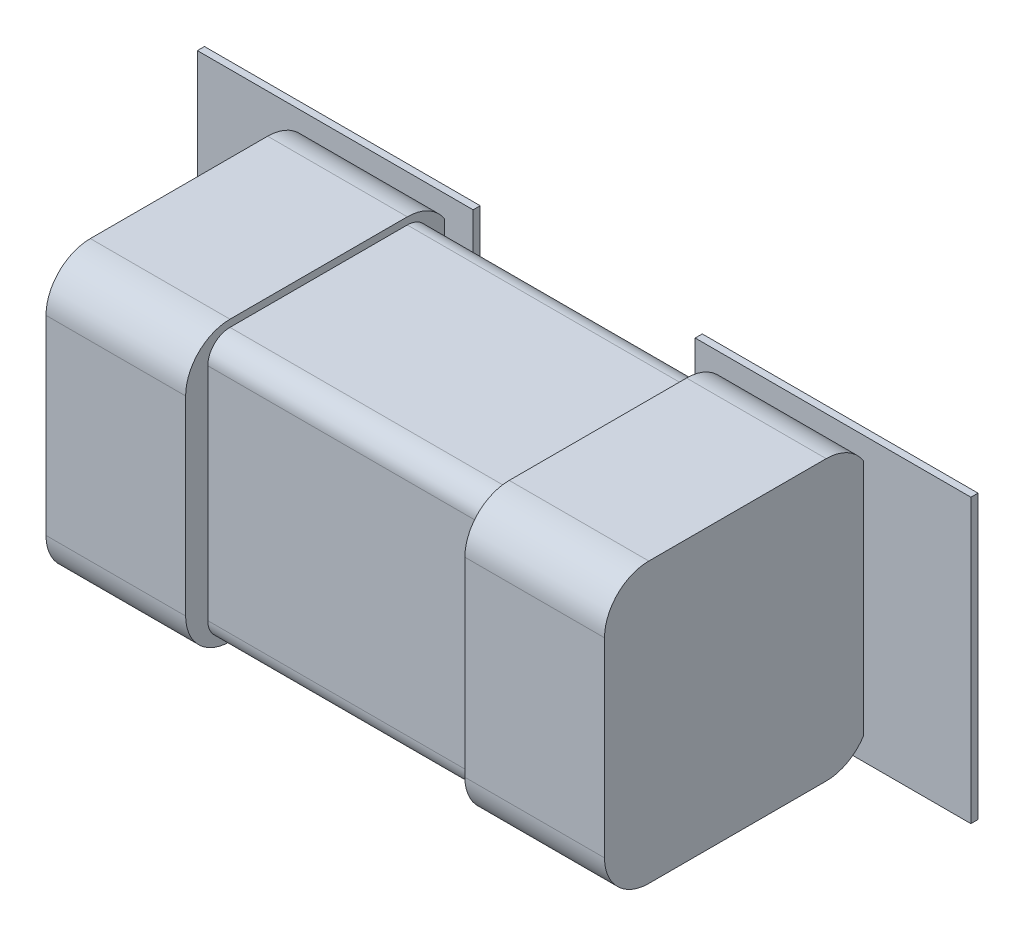
ISO-10303-21;
HEADER;
FILE_DESCRIPTION(('STEP AP214'),'2;1');
FILE_NAME('part.step','',(''),(''),'','','');
FILE_SCHEMA(('AUTOMOTIVE_DESIGN { 1 0 10303 214 1 1 1 1 }'));
ENDSEC;
DATA;
#1=APPLICATION_CONTEXT('core data for automotive mechanical design processes');
#2=APPLICATION_PROTOCOL_DEFINITION('international standard','automotive_design',2000,#1);
#3=PRODUCT_CONTEXT('',#1,'mechanical');
#4=PRODUCT('Part','Part','',(#3));
#5=PRODUCT_RELATED_PRODUCT_CATEGORY('part','',(#4));
#6=PRODUCT_DEFINITION_FORMATION('','',#4);
#7=PRODUCT_DEFINITION_CONTEXT('part definition',#1,'design');
#8=PRODUCT_DEFINITION('design','',#6,#7);
#9=PRODUCT_DEFINITION_SHAPE('','',#8);
#10=(LENGTH_UNIT() NAMED_UNIT(*) SI_UNIT(.MILLI.,.METRE.));
#11=(NAMED_UNIT(*) PLANE_ANGLE_UNIT() SI_UNIT($,.RADIAN.));
#12=(NAMED_UNIT(*) SI_UNIT($,.STERADIAN.) SOLID_ANGLE_UNIT());
#13=UNCERTAINTY_MEASURE_WITH_UNIT(LENGTH_MEASURE(1.E-05),#10,'distance_accuracy_value','');
#14=(GEOMETRIC_REPRESENTATION_CONTEXT(3) GLOBAL_UNCERTAINTY_ASSIGNED_CONTEXT((#13)) GLOBAL_UNIT_ASSIGNED_CONTEXT((#10,
#11,#12)) REPRESENTATION_CONTEXT('',''));
#15=CARTESIAN_POINT('',(0.,0.,0.));
#16=DIRECTION('',(0.,0.,1.));
#17=DIRECTION('',(1.,0.,0.));
#18=AXIS2_PLACEMENT_3D('',#15,#16,#17);
#19=CARTESIAN_POINT('',(0.,0.,0.0762));
#20=DIRECTION('',(0.,0.,1.));
#21=DIRECTION('',(1.,0.,0.));
#22=AXIS2_PLACEMENT_3D('',#19,#20,#21);
#23=PLANE('',#22);
#24=DIRECTION('',(0.,1.,0.));
#25=VECTOR('',#24,1.);
#26=CARTESIAN_POINT('',(-0.318008,-0.405003,0.0762));
#27=LINE('',#26,#25);
#28=CARTESIAN_POINT('',(-0.318008,-0.405003,0.0762));
#29=VERTEX_POINT('',#28);
#30=CARTESIAN_POINT('',(-0.318008,0.405003,0.0762));
#31=VERTEX_POINT('',#30);
#32=EDGE_CURVE('E281',#29,#31,#27,.T.);
#33=ORIENTED_EDGE('',*,*,#32,.F.);
#34=DIRECTION('',(1.,0.,0.));
#35=VECTOR('',#34,1.);
#36=CARTESIAN_POINT('',(-1.1079988,-0.405003,0.0762));
#37=LINE('',#36,#35);
#38=CARTESIAN_POINT('',(-1.1079988,-0.405003,0.0762));
#39=VERTEX_POINT('',#38);
#40=EDGE_CURVE('E286',#39,#29,#37,.T.);
#41=ORIENTED_EDGE('',*,*,#40,.F.);
#42=DIRECTION('',(0.,1.,0.));
#43=VECTOR('',#42,1.);
#44=CARTESIAN_POINT('',(-1.1079988,0.405003,0.0762));
#45=LINE('',#44,#43);
#46=CARTESIAN_POINT('',(-1.1079988,0.405003,0.0762));
#47=VERTEX_POINT('',#46);
#48=EDGE_CURVE('E258',#47,#39,#45,.F.);
#49=ORIENTED_EDGE('',*,*,#48,.F.);
#50=DIRECTION('',(1.,0.,0.));
#51=VECTOR('',#50,1.);
#52=CARTESIAN_POINT('',(-0.318008,0.405003,0.0762));
#53=LINE('',#52,#51);
#54=EDGE_CURVE('E276',#31,#47,#53,.F.);
#55=ORIENTED_EDGE('',*,*,#54,.F.);
#56=EDGE_LOOP('',(#33,#41,#49,#55));
#57=FACE_BOUND('',#56,.T.);
#58=ADVANCED_FACE('F15',(#57),#23,.F.);
#59=CARTESIAN_POINT('',(-1.1079988,-0.405003,0.0762));
#60=DIRECTION('',(0.,-1.,0.));
#61=DIRECTION('',(0.,0.,-1.));
#62=AXIS2_PLACEMENT_3D('',#59,#60,#61);
#63=PLANE('',#62);
#64=DIRECTION('',(0.,0.,1.));
#65=VECTOR('',#64,1.);
#66=CARTESIAN_POINT('',(-1.1079988,-0.405003,0.0762));
#67=LINE('',#66,#65);
#68=CARTESIAN_POINT('',(-1.1079988,-0.405003,0.09652));
#69=VERTEX_POINT('',#68);
#70=EDGE_CURVE('E274',#39,#69,#67,.T.);
#71=ORIENTED_EDGE('',*,*,#70,.F.);
#72=ORIENTED_EDGE('',*,*,#40,.T.);
#73=DIRECTION('',(0.,0.,-1.));
#74=VECTOR('',#73,1.);
#75=CARTESIAN_POINT('',(-0.318008,-0.405003,0.0762));
#76=LINE('',#75,#74);
#77=CARTESIAN_POINT('',(-0.318008,-0.405003,0.09652));
#78=VERTEX_POINT('',#77);
#79=EDGE_CURVE('E283',#78,#29,#76,.T.);
#80=ORIENTED_EDGE('',*,*,#79,.F.);
#81=DIRECTION('',(1.,0.,0.));
#82=VECTOR('',#81,1.);
#83=CARTESIAN_POINT('',(0.,-0.405003,0.09652));
#84=LINE('',#83,#82);
#85=EDGE_CURVE('E257',#69,#78,#84,.T.);
#86=ORIENTED_EDGE('',*,*,#85,.F.);
#87=EDGE_LOOP('',(#71,#72,#80,#86));
#88=FACE_BOUND('',#87,.T.);
#89=ADVANCED_FACE('F915',(#88),#63,.T.);
#90=CARTESIAN_POINT('',(-0.318008,-0.405003,0.0762));
#91=DIRECTION('',(1.,0.,0.));
#92=DIRECTION('',(0.,0.,-1.));
#93=AXIS2_PLACEMENT_3D('',#90,#91,#92);
#94=PLANE('',#93);
#95=ORIENTED_EDGE('',*,*,#79,.T.);
#96=ORIENTED_EDGE('',*,*,#32,.T.);
#97=DIRECTION('',(0.,0.,1.));
#98=VECTOR('',#97,1.);
#99=CARTESIAN_POINT('',(-0.318008,0.405003,0.0762));
#100=LINE('',#99,#98);
#101=CARTESIAN_POINT('',(-0.318008,0.405003,0.09652));
#102=VERTEX_POINT('',#101);
#103=EDGE_CURVE('E278',#102,#31,#100,.F.);
#104=ORIENTED_EDGE('',*,*,#103,.F.);
#105=DIRECTION('',(0.,1.,0.));
#106=VECTOR('',#105,1.);
#107=CARTESIAN_POINT('',(-0.318008,0.,0.09652));
#108=LINE('',#107,#106);
#109=EDGE_CURVE('E255',#78,#102,#108,.T.);
#110=ORIENTED_EDGE('',*,*,#109,.F.);
#111=EDGE_LOOP('',(#95,#96,#104,#110));
#112=FACE_BOUND('',#111,.T.);
#113=ADVANCED_FACE('F906',(#112),#94,.T.);
#114=CARTESIAN_POINT('',(-0.318008,0.405003,0.0762));
#115=DIRECTION('',(0.,1.,0.));
#116=DIRECTION('',(0.,0.,1.));
#117=AXIS2_PLACEMENT_3D('',#114,#115,#116);
#118=PLANE('',#117);
#119=ORIENTED_EDGE('',*,*,#103,.T.);
#120=ORIENTED_EDGE('',*,*,#54,.T.);
#121=DIRECTION('',(0.,0.,1.));
#122=VECTOR('',#121,1.);
#123=CARTESIAN_POINT('',(-1.1079988,0.405003,0.0762));
#124=LINE('',#123,#122);
#125=CARTESIAN_POINT('',(-1.1079988,0.405003,0.09652));
#126=VERTEX_POINT('',#125);
#127=EDGE_CURVE('E271',#126,#47,#124,.F.);
#128=ORIENTED_EDGE('',*,*,#127,.F.);
#129=DIRECTION('',(1.,0.,0.));
#130=VECTOR('',#129,1.);
#131=CARTESIAN_POINT('',(0.,0.405003,0.09652));
#132=LINE('',#131,#130);
#133=EDGE_CURVE('E253',#102,#126,#132,.F.);
#134=ORIENTED_EDGE('',*,*,#133,.F.);
#135=EDGE_LOOP('',(#119,#120,#128,#134));
#136=FACE_BOUND('',#135,.T.);
#137=ADVANCED_FACE('F897',(#136),#118,.T.);
#138=CARTESIAN_POINT('',(-1.1079988,0.405003,0.0762));
#139=DIRECTION('',(-1.,0.,0.));
#140=DIRECTION('',(0.,0.,1.));
#141=AXIS2_PLACEMENT_3D('',#138,#139,#140);
#142=PLANE('',#141);
#143=ORIENTED_EDGE('',*,*,#127,.T.);
#144=ORIENTED_EDGE('',*,*,#48,.T.);
#145=ORIENTED_EDGE('',*,*,#70,.T.);
#146=DIRECTION('',(0.,1.,0.));
#147=VECTOR('',#146,1.);
#148=CARTESIAN_POINT('',(-1.1079988,0.,0.09652));
#149=LINE('',#148,#147);
#150=EDGE_CURVE('E236',#126,#69,#149,.F.);
#151=ORIENTED_EDGE('',*,*,#150,.F.);
#152=EDGE_LOOP('',(#143,#144,#145,#151));
#153=FACE_BOUND('',#152,.T.);
#154=ADVANCED_FACE('F887',(#153),#142,.T.);
#155=CARTESIAN_POINT('',(-0.800000000000102,0.399999999999924,0.0762));
#156=DIRECTION('',(-1.,0.,0.));
#157=DIRECTION('',(0.,0.,1.));
#158=AXIS2_PLACEMENT_3D('',#155,#156,#157);
#159=PLANE('',#158);
#160=CARTESIAN_POINT('',(-0.800000000000102,0.272999999999924,0.2032));
#161=DIRECTION('',(1.,0.,0.));
#162=DIRECTION('',(0.,0.,-1.));
#163=AXIS2_PLACEMENT_3D('',#160,#161,#162);
#164=CIRCLE('',#163,0.127);
#165=CARTESIAN_POINT('',(-0.800000000000102,0.341908472628476,0.0965199999999994));
#166=VERTEX_POINT('',#165);
#167=CARTESIAN_POINT('',(-0.800000000000102,0.399999999999924,0.2032));
#168=VERTEX_POINT('',#167);
#169=EDGE_CURVE('E230',#166,#168,#164,.T.);
#170=ORIENTED_EDGE('',*,*,#169,.F.);
#171=DIRECTION('',(0.,1.,0.));
#172=VECTOR('',#171,1.);
#173=CARTESIAN_POINT('',(-0.800000000000102,0.,0.09652));
#174=LINE('',#173,#172);
#175=CARTESIAN_POINT('',(-0.800000000000102,-0.341908472628476,0.0965199999999994));
#176=VERTEX_POINT('',#175);
#177=EDGE_CURVE('E225',#176,#166,#174,.T.);
#178=ORIENTED_EDGE('',*,*,#177,.F.);
#179=CARTESIAN_POINT('',(-0.800000000000102,-0.272999999999924,0.2032));
#180=DIRECTION('',(1.,0.,0.));
#181=DIRECTION('',(0.,0.,-1.));
#182=AXIS2_PLACEMENT_3D('',#179,#180,#181);
#183=CIRCLE('',#182,0.127);
#184=CARTESIAN_POINT('',(-0.800000000000102,-0.399999999999924,0.2032));
#185=VERTEX_POINT('',#184);
#186=EDGE_CURVE('E18',#185,#176,#183,.T.);
#187=ORIENTED_EDGE('',*,*,#186,.F.);
#188=DIRECTION('',(0.,0.,-1.));
#189=VECTOR('',#188,1.);
#190=CARTESIAN_POINT('',(-0.800000000000102,-0.399999999999924,0.0762));
#191=LINE('',#190,#189);
#192=CARTESIAN_POINT('',(-0.800000000000102,-0.399999999999924,0.7112));
#193=VERTEX_POINT('',#192);
#194=EDGE_CURVE('E220',#193,#185,#191,.T.);
#195=ORIENTED_EDGE('',*,*,#194,.F.);
#196=CARTESIAN_POINT('',(-0.800000000000102,-0.272999999999924,0.7112));
#197=DIRECTION('',(1.,0.,0.));
#198=DIRECTION('',(0.,0.,-1.));
#199=AXIS2_PLACEMENT_3D('',#196,#197,#198);
#200=CIRCLE('',#199,0.127);
#201=CARTESIAN_POINT('',(-0.800000000000102,-0.272999999999924,0.8382));
#202=VERTEX_POINT('',#201);
#203=EDGE_CURVE('E367',#202,#193,#200,.T.);
#204=ORIENTED_EDGE('',*,*,#203,.F.);
#205=DIRECTION('',(0.,1.,0.));
#206=VECTOR('',#205,1.);
#207=CARTESIAN_POINT('',(-0.800000000000102,0.,0.8382));
#208=LINE('',#207,#206);
#209=CARTESIAN_POINT('',(-0.800000000000102,0.272999999999924,0.8382));
#210=VERTEX_POINT('',#209);
#211=EDGE_CURVE('E264',#210,#202,#208,.F.);
#212=ORIENTED_EDGE('',*,*,#211,.F.);
#213=CARTESIAN_POINT('',(-0.800000000000102,0.272999999999924,0.7112));
#214=DIRECTION('',(-1.,0.,0.));
#215=DIRECTION('',(0.,0.,1.));
#216=AXIS2_PLACEMENT_3D('',#213,#214,#215);
#217=CIRCLE('',#216,0.127);
#218=CARTESIAN_POINT('',(-0.800000000000102,0.399999999999924,0.7112));
#219=VERTEX_POINT('',#218);
#220=EDGE_CURVE('E263',#219,#210,#217,.F.);
#221=ORIENTED_EDGE('',*,*,#220,.F.);
#222=DIRECTION('',(0.,0.,1.));
#223=VECTOR('',#222,1.);
#224=CARTESIAN_POINT('',(-0.800000000000102,0.399999999999924,0.0762));
#225=LINE('',#224,#223);
#226=EDGE_CURVE('E260',#168,#219,#225,.T.);
#227=ORIENTED_EDGE('',*,*,#226,.F.);
#228=EDGE_LOOP('',(#170,#178,#187,#195,#204,#212,#221,#227));
#229=FACE_BOUND('',#228,.T.);
#230=ADVANCED_FACE('F227',(#229),#159,.T.);
#231=CARTESIAN_POINT('',(0.,0.,0.09652));
#232=DIRECTION('',(0.,0.,1.));
#233=DIRECTION('',(1.,0.,0.));
#234=AXIS2_PLACEMENT_3D('',#231,#232,#233);
#235=PLANE('',#234);
#236=DIRECTION('',(1.,0.,0.));
#237=VECTOR('',#236,1.);
#238=CARTESIAN_POINT('',(0.800000000000102,-0.341908472628475,0.0965199999999988));
#239=LINE('',#238,#237);
#240=CARTESIAN_POINT('',(-0.399999999999924,-0.341908472628476,0.0965199999999994));
#241=VERTEX_POINT('',#240);
#242=EDGE_CURVE('E235',#176,#241,#239,.T.);
#243=ORIENTED_EDGE('',*,*,#242,.F.);
#244=ORIENTED_EDGE('',*,*,#177,.T.);
#245=DIRECTION('',(1.,0.,0.));
#246=VECTOR('',#245,1.);
#247=CARTESIAN_POINT('',(0.800000000000102,0.341908472628475,0.0965199999999988));
#248=LINE('',#247,#246);
#249=CARTESIAN_POINT('',(-0.399999999999924,0.341908472628476,0.0965199999999994));
#250=VERTEX_POINT('',#249);
#251=EDGE_CURVE('E364',#250,#166,#248,.F.);
#252=ORIENTED_EDGE('',*,*,#251,.F.);
#253=DIRECTION('',(0.,1.,0.));
#254=VECTOR('',#253,1.);
#255=CARTESIAN_POINT('',(-0.399999999999924,0.399999999999924,0.09652));
#256=LINE('',#255,#254);
#257=EDGE_CURVE('E246',#250,#241,#256,.F.);
#258=ORIENTED_EDGE('',*,*,#257,.T.);
#259=EDGE_LOOP('',(#243,#244,#252,#258));
#260=FACE_BOUND('',#259,.T.);
#261=ORIENTED_EDGE('',*,*,#133,.T.);
#262=ORIENTED_EDGE('',*,*,#150,.T.);
#263=ORIENTED_EDGE('',*,*,#85,.T.);
#264=ORIENTED_EDGE('',*,*,#109,.T.);
#265=EDGE_LOOP('',(#261,#262,#263,#264));
#266=FACE_BOUND('',#265,.T.);
#267=ADVANCED_FACE('F244',(#260,#266),#235,.T.);
#268=CARTESIAN_POINT('',(0.800000000000102,-0.272999999999924,0.2032));
#269=DIRECTION('',(1.,0.,0.));
#270=DIRECTION('',(0.,0.,-1.));
#271=AXIS2_PLACEMENT_3D('',#268,#269,#270);
#272=CYLINDRICAL_SURFACE('',#271,0.127);
#273=DIRECTION('',(1.,0.,0.));
#274=VECTOR('',#273,1.);
#275=CARTESIAN_POINT('',(-0.800000000000102,-0.399999999999924,0.2032));
#276=LINE('',#275,#274);
#277=CARTESIAN_POINT('',(-0.399999999999924,-0.399999999999924,0.2032));
#278=VERTEX_POINT('',#277);
#279=EDGE_CURVE('E242',#185,#278,#276,.T.);
#280=ORIENTED_EDGE('',*,*,#279,.F.);
#281=ORIENTED_EDGE('',*,*,#186,.T.);
#282=ORIENTED_EDGE('',*,*,#242,.T.);
#283=CARTESIAN_POINT('',(-0.399999999999924,-0.272999999999924,0.2032));
#284=DIRECTION('',(1.,0.,0.));
#285=DIRECTION('',(0.,0.,-1.));
#286=AXIS2_PLACEMENT_3D('',#283,#284,#285);
#287=CIRCLE('',#286,0.127);
#288=EDGE_CURVE('E361',#241,#278,#287,.F.);
#289=ORIENTED_EDGE('',*,*,#288,.T.);
#290=EDGE_LOOP('',(#280,#281,#282,#289));
#291=FACE_BOUND('',#290,.T.);
#292=ADVANCED_FACE('F239',(#291),#272,.T.);
#293=CARTESIAN_POINT('',(-0.800000000000102,-0.399999999999924,0.0762));
#294=DIRECTION('',(0.,-1.,0.));
#295=DIRECTION('',(0.,0.,-1.));
#296=AXIS2_PLACEMENT_3D('',#293,#294,#295);
#297=PLANE('',#296);
#298=ORIENTED_EDGE('',*,*,#194,.T.);
#299=ORIENTED_EDGE('',*,*,#279,.T.);
#300=DIRECTION('',(0.,0.,1.));
#301=VECTOR('',#300,1.);
#302=CARTESIAN_POINT('',(-0.399999999999924,-0.399999999999924,0.8382));
#303=LINE('',#302,#301);
#304=CARTESIAN_POINT('',(-0.399999999999924,-0.399999999999924,0.7112));
#305=VERTEX_POINT('',#304);
#306=EDGE_CURVE('E360',#278,#305,#303,.T.);
#307=ORIENTED_EDGE('',*,*,#306,.T.);
#308=DIRECTION('',(1.,0.,0.));
#309=VECTOR('',#308,1.);
#310=CARTESIAN_POINT('',(-0.803812363453338,-0.399999999999924,0.7112));
#311=LINE('',#310,#309);
#312=EDGE_CURVE('E267',#193,#305,#311,.T.);
#313=ORIENTED_EDGE('',*,*,#312,.F.);
#314=EDGE_LOOP('',(#298,#299,#307,#313));
#315=FACE_BOUND('',#314,.T.);
#316=ADVANCED_FACE('F373',(#315),#297,.T.);
#317=CARTESIAN_POINT('',(-0.803812363453338,-0.272999999999924,0.7112));
#318=DIRECTION('',(1.,0.,0.));
#319=DIRECTION('',(0.,0.,-1.));
#320=AXIS2_PLACEMENT_3D('',#317,#318,#319);
#321=CYLINDRICAL_SURFACE('',#320,0.127);
#322=ORIENTED_EDGE('',*,*,#312,.T.);
#323=CARTESIAN_POINT('',(-0.399999999999924,-0.272999999999924,0.7112));
#324=DIRECTION('',(1.,0.,0.));
#325=DIRECTION('',(0.,0.,-1.));
#326=AXIS2_PLACEMENT_3D('',#323,#324,#325);
#327=CIRCLE('',#326,0.127);
#328=CARTESIAN_POINT('',(-0.399999999999924,-0.272999999999924,0.8382));
#329=VERTEX_POINT('',#328);
#330=EDGE_CURVE('E357',#305,#329,#327,.F.);
#331=ORIENTED_EDGE('',*,*,#330,.T.);
#332=DIRECTION('',(1.,0.,0.));
#333=VECTOR('',#332,1.);
#334=CARTESIAN_POINT('',(0.,-0.272999999999924,0.8382));
#335=LINE('',#334,#333);
#336=EDGE_CURVE('E266',#202,#329,#335,.T.);
#337=ORIENTED_EDGE('',*,*,#336,.F.);
#338=ORIENTED_EDGE('',*,*,#203,.T.);
#339=EDGE_LOOP('',(#322,#331,#337,#338));
#340=FACE_BOUND('',#339,.T.);
#341=ADVANCED_FACE('F400',(#340),#321,.T.);
#342=CARTESIAN_POINT('',(0.,0.,0.8382));
#343=DIRECTION('',(0.,0.,1.));
#344=DIRECTION('',(1.,0.,0.));
#345=AXIS2_PLACEMENT_3D('',#342,#343,#344);
#346=PLANE('',#345);
#347=DIRECTION('',(0.,1.,0.));
#348=VECTOR('',#347,1.);
#349=CARTESIAN_POINT('',(-0.399999999999924,0.399999999999924,0.8382));
#350=LINE('',#349,#348);
#351=CARTESIAN_POINT('',(-0.399999999999924,0.272999999999924,0.8382));
#352=VERTEX_POINT('',#351);
#353=EDGE_CURVE('E356',#329,#352,#350,.T.);
#354=ORIENTED_EDGE('',*,*,#353,.T.);
#355=DIRECTION('',(-1.,0.,0.));
#356=VECTOR('',#355,1.);
#357=CARTESIAN_POINT('',(0.803665688317936,0.272999999999924,0.8382));
#358=LINE('',#357,#356);
#359=EDGE_CURVE('E366',#210,#352,#358,.F.);
#360=ORIENTED_EDGE('',*,*,#359,.F.);
#361=ORIENTED_EDGE('',*,*,#211,.T.);
#362=ORIENTED_EDGE('',*,*,#336,.T.);
#363=EDGE_LOOP('',(#354,#360,#361,#362));
#364=FACE_BOUND('',#363,.T.);
#365=ADVANCED_FACE('F397',(#364),#346,.T.);
#366=CARTESIAN_POINT('',(0.803665688317936,0.272999999999924,0.7112));
#367=DIRECTION('',(-1.,0.,0.));
#368=DIRECTION('',(0.,0.,1.));
#369=AXIS2_PLACEMENT_3D('',#366,#367,#368);
#370=CYLINDRICAL_SURFACE('',#369,0.127);
#371=DIRECTION('',(1.,0.,0.));
#372=VECTOR('',#371,1.);
#373=CARTESIAN_POINT('',(0.800000000000102,0.399999999999924,0.7112));
#374=LINE('',#373,#372);
#375=CARTESIAN_POINT('',(-0.399999999999924,0.399999999999924,0.7112));
#376=VERTEX_POINT('',#375);
#377=EDGE_CURVE('E262',#219,#376,#374,.T.);
#378=ORIENTED_EDGE('',*,*,#377,.F.);
#379=ORIENTED_EDGE('',*,*,#220,.T.);
#380=ORIENTED_EDGE('',*,*,#359,.T.);
#381=CARTESIAN_POINT('',(-0.399999999999924,0.272999999999924,0.7112));
#382=DIRECTION('',(-1.,0.,0.));
#383=DIRECTION('',(0.,0.,1.));
#384=AXIS2_PLACEMENT_3D('',#381,#382,#383);
#385=CIRCLE('',#384,0.127);
#386=EDGE_CURVE('E353',#352,#376,#385,.T.);
#387=ORIENTED_EDGE('',*,*,#386,.T.);
#388=EDGE_LOOP('',(#378,#379,#380,#387));
#389=FACE_BOUND('',#388,.T.);
#390=ADVANCED_FACE('F408',(#389),#370,.T.);
#391=CARTESIAN_POINT('',(0.800000000000102,0.399999999999924,0.0762));
#392=DIRECTION('',(0.,1.,0.));
#393=DIRECTION('',(0.,0.,1.));
#394=AXIS2_PLACEMENT_3D('',#391,#392,#393);
#395=PLANE('',#394);
#396=DIRECTION('',(0.,0.,1.));
#397=VECTOR('',#396,1.);
#398=CARTESIAN_POINT('',(-0.399999999999924,0.399999999999924,0.8382));
#399=LINE('',#398,#397);
#400=CARTESIAN_POINT('',(-0.399999999999924,0.399999999999924,0.2032));
#401=VERTEX_POINT('',#400);
#402=EDGE_CURVE('E352',#376,#401,#399,.F.);
#403=ORIENTED_EDGE('',*,*,#402,.T.);
#404=DIRECTION('',(1.,0.,0.));
#405=VECTOR('',#404,1.);
#406=CARTESIAN_POINT('',(0.800000000000102,0.399999999999924,0.2032));
#407=LINE('',#406,#405);
#408=EDGE_CURVE('E390',#168,#401,#407,.T.);
#409=ORIENTED_EDGE('',*,*,#408,.F.);
#410=ORIENTED_EDGE('',*,*,#226,.T.);
#411=ORIENTED_EDGE('',*,*,#377,.T.);
#412=EDGE_LOOP('',(#403,#409,#410,#411));
#413=FACE_BOUND('',#412,.T.);
#414=ADVANCED_FACE('F512',(#413),#395,.T.);
#415=CARTESIAN_POINT('',(0.800000000000102,0.272999999999924,0.2032));
#416=DIRECTION('',(1.,0.,0.));
#417=DIRECTION('',(0.,0.,-1.));
#418=AXIS2_PLACEMENT_3D('',#415,#416,#417);
#419=CYLINDRICAL_SURFACE('',#418,0.127);
#420=ORIENTED_EDGE('',*,*,#251,.T.);
#421=ORIENTED_EDGE('',*,*,#169,.T.);
#422=ORIENTED_EDGE('',*,*,#408,.T.);
#423=CARTESIAN_POINT('',(-0.399999999999924,0.272999999999924,0.2032));
#424=DIRECTION('',(1.,0.,0.));
#425=DIRECTION('',(0.,0.,-1.));
#426=AXIS2_PLACEMENT_3D('',#423,#424,#425);
#427=CIRCLE('',#426,0.127);
#428=EDGE_CURVE('E349',#401,#250,#427,.F.);
#429=ORIENTED_EDGE('',*,*,#428,.T.);
#430=EDGE_LOOP('',(#420,#421,#422,#429));
#431=FACE_BOUND('',#430,.T.);
#432=ADVANCED_FACE('F508',(#431),#419,.T.);
#433=CARTESIAN_POINT('',(-0.399999999999924,0.399999999999924,0.8382));
#434=DIRECTION('',(-1.,0.,0.));
#435=DIRECTION('',(0.,0.,1.));
#436=AXIS2_PLACEMENT_3D('',#433,#434,#435);
#437=PLANE('',#436);
#438=DIRECTION('',(0.,1.,0.));
#439=VECTOR('',#438,1.);
#440=CARTESIAN_POINT('',(-0.399999999999924,0.379679999999924,0.1397));
#441=LINE('',#440,#439);
#442=CARTESIAN_POINT('',(-0.399999999999924,0.316179999999924,0.1397));
#443=VERTEX_POINT('',#442);
#444=CARTESIAN_POINT('',(-0.399999999999924,-0.316179999999924,0.1397));
#445=VERTEX_POINT('',#444);
#446=EDGE_CURVE('E340',#443,#445,#441,.F.);
#447=ORIENTED_EDGE('',*,*,#446,.T.);
#448=CARTESIAN_POINT('',(-0.399999999999924,-0.316179999999924,0.2032));
#449=DIRECTION('',(1.,0.,0.));
#450=DIRECTION('',(0.,0.,-1.));
#451=AXIS2_PLACEMENT_3D('',#448,#449,#450);
#452=CIRCLE('',#451,0.0635);
#453=CARTESIAN_POINT('',(-0.399999999999924,-0.379679999999924,0.2032));
#454=VERTEX_POINT('',#453);
#455=EDGE_CURVE('E337',#454,#445,#452,.T.);
#456=ORIENTED_EDGE('',*,*,#455,.F.);
#457=DIRECTION('',(0.,0.,1.));
#458=VECTOR('',#457,1.);
#459=CARTESIAN_POINT('',(-0.399999999999924,-0.379679999999924,0.8382));
#460=LINE('',#459,#458);
#461=CARTESIAN_POINT('',(-0.399999999999924,-0.379679999999924,0.7112));
#462=VERTEX_POINT('',#461);
#463=EDGE_CURVE('E336',#454,#462,#460,.T.);
#464=ORIENTED_EDGE('',*,*,#463,.T.);
#465=CARTESIAN_POINT('',(-0.399999999999924,-0.316179999999924,0.7112));
#466=DIRECTION('',(-1.,0.,0.));
#467=DIRECTION('',(0.,0.,1.));
#468=AXIS2_PLACEMENT_3D('',#465,#466,#467);
#469=CIRCLE('',#468,0.0635);
#470=CARTESIAN_POINT('',(-0.399999999999924,-0.316179999999924,0.7747));
#471=VERTEX_POINT('',#470);
#472=EDGE_CURVE('E333',#471,#462,#469,.F.);
#473=ORIENTED_EDGE('',*,*,#472,.F.);
#474=DIRECTION('',(0.,1.,0.));
#475=VECTOR('',#474,1.);
#476=CARTESIAN_POINT('',(-0.399999999999924,0.379679999999924,0.7747));
#477=LINE('',#476,#475);
#478=CARTESIAN_POINT('',(-0.399999999999924,0.316179999999924,0.7747));
#479=VERTEX_POINT('',#478);
#480=EDGE_CURVE('E348',#471,#479,#477,.T.);
#481=ORIENTED_EDGE('',*,*,#480,.T.);
#482=CARTESIAN_POINT('',(-0.399999999999924,0.316179999999924,0.7112));
#483=DIRECTION('',(1.,0.,0.));
#484=DIRECTION('',(0.,0.,-1.));
#485=AXIS2_PLACEMENT_3D('',#482,#483,#484);
#486=CIRCLE('',#485,0.0635);
#487=CARTESIAN_POINT('',(-0.399999999999924,0.379679999999924,0.7112));
#488=VERTEX_POINT('',#487);
#489=EDGE_CURVE('E345',#488,#479,#486,.T.);
#490=ORIENTED_EDGE('',*,*,#489,.F.);
#491=DIRECTION('',(0.,0.,-1.));
#492=VECTOR('',#491,1.);
#493=CARTESIAN_POINT('',(-0.399999999999924,0.379679999999924,0.8382));
#494=LINE('',#493,#492);
#495=CARTESIAN_POINT('',(-0.399999999999924,0.379679999999924,0.2032));
#496=VERTEX_POINT('',#495);
#497=EDGE_CURVE('E344',#488,#496,#494,.T.);
#498=ORIENTED_EDGE('',*,*,#497,.T.);
#499=CARTESIAN_POINT('',(-0.399999999999924,0.316179999999924,0.2032));
#500=DIRECTION('',(-1.,0.,0.));
#501=DIRECTION('',(0.,0.,1.));
#502=AXIS2_PLACEMENT_3D('',#499,#500,#501);
#503=CIRCLE('',#502,0.0635);
#504=EDGE_CURVE('E341',#443,#496,#503,.F.);
#505=ORIENTED_EDGE('',*,*,#504,.F.);
#506=EDGE_LOOP('',(#447,#456,#464,#473,#481,#490,#498,#505));
#507=FACE_BOUND('',#506,.T.);
#508=ORIENTED_EDGE('',*,*,#402,.F.);
#509=ORIENTED_EDGE('',*,*,#386,.F.);
#510=ORIENTED_EDGE('',*,*,#353,.F.);
#511=ORIENTED_EDGE('',*,*,#330,.F.);
#512=ORIENTED_EDGE('',*,*,#306,.F.);
#513=ORIENTED_EDGE('',*,*,#288,.F.);
#514=ORIENTED_EDGE('',*,*,#257,.F.);
#515=ORIENTED_EDGE('',*,*,#428,.F.);
#516=EDGE_LOOP('',(#508,#509,#510,#511,#512,#513,#514,#515));
#517=FACE_BOUND('',#516,.T.);
#518=ADVANCED_FACE('F377',(#507,#517),#437,.F.);
#519=CARTESIAN_POINT('',(0.399999999999924,0.379679999999924,0.7747));
#520=DIRECTION('',(0.,0.,-1.));
#521=DIRECTION('',(-1.,0.,0.));
#522=AXIS2_PLACEMENT_3D('',#519,#520,#521);
#523=PLANE('',#522);
#524=DIRECTION('',(-1.,0.,0.));
#525=VECTOR('',#524,1.);
#526=CARTESIAN_POINT('',(0.40381236345316,-0.316179999999924,0.7747));
#527=LINE('',#526,#525);
#528=CARTESIAN_POINT('',(0.399999999999924,-0.316179999999924,0.7747));
#529=VERTEX_POINT('',#528);
#530=EDGE_CURVE('E541',#529,#471,#527,.T.);
#531=ORIENTED_EDGE('',*,*,#530,.F.);
#532=DIRECTION('',(0.,1.,0.));
#533=VECTOR('',#532,1.);
#534=CARTESIAN_POINT('',(0.399999999999924,0.379679999999924,0.7747));
#535=LINE('',#534,#533);
#536=CARTESIAN_POINT('',(0.399999999999924,0.316179999999924,0.7747));
#537=VERTEX_POINT('',#536);
#538=EDGE_CURVE('E320',#529,#537,#535,.T.);
#539=ORIENTED_EDGE('',*,*,#538,.T.);
#540=DIRECTION('',(1.,0.,0.));
#541=VECTOR('',#540,1.);
#542=CARTESIAN_POINT('',(-0.40399622802447,0.316179999999924,0.7747));
#543=LINE('',#542,#541);
#544=EDGE_CURVE('E347',#479,#537,#543,.T.);
#545=ORIENTED_EDGE('',*,*,#544,.F.);
#546=ORIENTED_EDGE('',*,*,#480,.F.);
#547=EDGE_LOOP('',(#531,#539,#545,#546));
#548=FACE_BOUND('',#547,.T.);
#549=ADVANCED_FACE('F501',(#548),#523,.F.);
#550=CARTESIAN_POINT('',(-0.40399622802447,0.316179999999924,0.7112));
#551=DIRECTION('',(1.,0.,0.));
#552=DIRECTION('',(0.,0.,-1.));
#553=AXIS2_PLACEMENT_3D('',#550,#551,#552);
#554=CYLINDRICAL_SURFACE('',#553,0.0635);
#555=ORIENTED_EDGE('',*,*,#489,.T.);
#556=ORIENTED_EDGE('',*,*,#544,.T.);
#557=CARTESIAN_POINT('',(0.399999999999924,0.316179999999924,0.7112));
#558=DIRECTION('',(1.,0.,0.));
#559=DIRECTION('',(0.,0.,-1.));
#560=AXIS2_PLACEMENT_3D('',#557,#558,#559);
#561=CIRCLE('',#560,0.0635);
#562=CARTESIAN_POINT('',(0.399999999999924,0.379679999999924,0.7112));
#563=VERTEX_POINT('',#562);
#564=EDGE_CURVE('E317',#537,#563,#561,.F.);
#565=ORIENTED_EDGE('',*,*,#564,.T.);
#566=DIRECTION('',(1.,0.,0.));
#567=VECTOR('',#566,1.);
#568=CARTESIAN_POINT('',(-0.399999999999924,0.379679999999924,0.7112));
#569=LINE('',#568,#567);
#570=EDGE_CURVE('E389',#563,#488,#569,.F.);
#571=ORIENTED_EDGE('',*,*,#570,.T.);
#572=EDGE_LOOP('',(#555,#556,#565,#571));
#573=FACE_BOUND('',#572,.T.);
#574=ADVANCED_FACE('F497',(#573),#554,.T.);
#575=CARTESIAN_POINT('',(-0.399999999999924,0.379679999999924,0.8382));
#576=DIRECTION('',(0.,-1.,0.));
#577=DIRECTION('',(0.,0.,-1.));
#578=AXIS2_PLACEMENT_3D('',#575,#576,#577);
#579=PLANE('',#578);
#580=ORIENTED_EDGE('',*,*,#570,.F.);
#581=DIRECTION('',(0.,0.,-1.));
#582=VECTOR('',#581,1.);
#583=CARTESIAN_POINT('',(0.399999999999924,0.379679999999924,0.8382));
#584=LINE('',#583,#582);
#585=CARTESIAN_POINT('',(0.399999999999924,0.379679999999924,0.2032));
#586=VERTEX_POINT('',#585);
#587=EDGE_CURVE('E316',#563,#586,#584,.T.);
#588=ORIENTED_EDGE('',*,*,#587,.T.);
#589=DIRECTION('',(-1.,0.,0.));
#590=VECTOR('',#589,1.);
#591=CARTESIAN_POINT('',(0.403665688318012,0.379679999999924,0.2032));
#592=LINE('',#591,#590);
#593=EDGE_CURVE('E343',#496,#586,#592,.F.);
#594=ORIENTED_EDGE('',*,*,#593,.F.);
#595=ORIENTED_EDGE('',*,*,#497,.F.);
#596=EDGE_LOOP('',(#580,#588,#594,#595));
#597=FACE_BOUND('',#596,.T.);
#598=ADVANCED_FACE('F493',(#597),#579,.F.);
#599=CARTESIAN_POINT('',(0.403665688318012,0.316179999999924,0.2032));
#600=DIRECTION('',(-1.,0.,0.));
#601=DIRECTION('',(0.,0.,1.));
#602=AXIS2_PLACEMENT_3D('',#599,#600,#601);
#603=CYLINDRICAL_SURFACE('',#602,0.0635);
#604=CARTESIAN_POINT('',(0.399999999999924,0.316179999999924,0.2032));
#605=DIRECTION('',(-1.,0.,0.));
#606=DIRECTION('',(0.,0.,1.));
#607=AXIS2_PLACEMENT_3D('',#604,#605,#606);
#608=CIRCLE('',#607,0.0635);
#609=CARTESIAN_POINT('',(0.399999999999924,0.316179999999924,0.1397));
#610=VERTEX_POINT('',#609);
#611=EDGE_CURVE('E313',#586,#610,#608,.T.);
#612=ORIENTED_EDGE('',*,*,#611,.T.);
#613=DIRECTION('',(1.,0.,0.));
#614=VECTOR('',#613,1.);
#615=CARTESIAN_POINT('',(-0.399999999999924,0.316179999999924,0.1397));
#616=LINE('',#615,#614);
#617=EDGE_CURVE('E386',#610,#443,#616,.F.);
#618=ORIENTED_EDGE('',*,*,#617,.T.);
#619=ORIENTED_EDGE('',*,*,#504,.T.);
#620=ORIENTED_EDGE('',*,*,#593,.T.);
#621=EDGE_LOOP('',(#612,#618,#619,#620));
#622=FACE_BOUND('',#621,.T.);
#623=ADVANCED_FACE('F489',(#622),#603,.T.);
#624=CARTESIAN_POINT('',(-0.399999999999924,0.379679999999924,0.1397));
#625=DIRECTION('',(0.,0.,1.));
#626=DIRECTION('',(1.,0.,0.));
#627=AXIS2_PLACEMENT_3D('',#624,#625,#626);
#628=PLANE('',#627);
#629=DIRECTION('',(1.,0.,0.));
#630=VECTOR('',#629,1.);
#631=CARTESIAN_POINT('',(-0.403665688318012,-0.316179999999924,0.1397));
#632=LINE('',#631,#630);
#633=CARTESIAN_POINT('',(0.399999999999924,-0.316179999999924,0.1397));
#634=VERTEX_POINT('',#633);
#635=EDGE_CURVE('E339',#445,#634,#632,.T.);
#636=ORIENTED_EDGE('',*,*,#635,.F.);
#637=ORIENTED_EDGE('',*,*,#446,.F.);
#638=ORIENTED_EDGE('',*,*,#617,.F.);
#639=DIRECTION('',(0.,1.,0.));
#640=VECTOR('',#639,1.);
#641=CARTESIAN_POINT('',(0.399999999999924,0.379679999999924,0.1397));
#642=LINE('',#641,#640);
#643=EDGE_CURVE('E312',#610,#634,#642,.F.);
#644=ORIENTED_EDGE('',*,*,#643,.T.);
#645=EDGE_LOOP('',(#636,#637,#638,#644));
#646=FACE_BOUND('',#645,.T.);
#647=ADVANCED_FACE('F485',(#646),#628,.F.);
#648=CARTESIAN_POINT('',(-0.403665688318012,-0.316179999999924,0.2032));
#649=DIRECTION('',(1.,0.,0.));
#650=DIRECTION('',(0.,0.,-1.));
#651=AXIS2_PLACEMENT_3D('',#648,#649,#650);
#652=CYLINDRICAL_SURFACE('',#651,0.0635);
#653=ORIENTED_EDGE('',*,*,#455,.T.);
#654=ORIENTED_EDGE('',*,*,#635,.T.);
#655=CARTESIAN_POINT('',(0.399999999999924,-0.316179999999924,0.2032));
#656=DIRECTION('',(1.,0.,0.));
#657=DIRECTION('',(0.,0.,-1.));
#658=AXIS2_PLACEMENT_3D('',#655,#656,#657);
#659=CIRCLE('',#658,0.0635);
#660=CARTESIAN_POINT('',(0.399999999999924,-0.379679999999924,0.2032));
#661=VERTEX_POINT('',#660);
#662=EDGE_CURVE('E309',#634,#661,#659,.F.);
#663=ORIENTED_EDGE('',*,*,#662,.T.);
#664=DIRECTION('',(1.,0.,0.));
#665=VECTOR('',#664,1.);
#666=CARTESIAN_POINT('',(0.399999999999924,-0.379679999999924,0.2032));
#667=LINE('',#666,#665);
#668=EDGE_CURVE('E529',#661,#454,#667,.F.);
#669=ORIENTED_EDGE('',*,*,#668,.T.);
#670=EDGE_LOOP('',(#653,#654,#663,#669));
#671=FACE_BOUND('',#670,.T.);
#672=ADVANCED_FACE('F481',(#671),#652,.T.);
#673=CARTESIAN_POINT('',(0.399999999999924,-0.379679999999924,0.8382));
#674=DIRECTION('',(0.,1.,0.));
#675=DIRECTION('',(0.,0.,1.));
#676=AXIS2_PLACEMENT_3D('',#673,#674,#675);
#677=PLANE('',#676);
#678=ORIENTED_EDGE('',*,*,#668,.F.);
#679=DIRECTION('',(0.,0.,-1.));
#680=VECTOR('',#679,1.);
#681=CARTESIAN_POINT('',(0.399999999999924,-0.379679999999924,0.8382));
#682=LINE('',#681,#680);
#683=CARTESIAN_POINT('',(0.399999999999924,-0.379679999999924,0.7112));
#684=VERTEX_POINT('',#683);
#685=EDGE_CURVE('E308',#661,#684,#682,.F.);
#686=ORIENTED_EDGE('',*,*,#685,.T.);
#687=DIRECTION('',(-1.,0.,0.));
#688=VECTOR('',#687,1.);
#689=CARTESIAN_POINT('',(0.40381236345316,-0.379679999999924,0.7112));
#690=LINE('',#689,#688);
#691=EDGE_CURVE('E335',#462,#684,#690,.F.);
#692=ORIENTED_EDGE('',*,*,#691,.F.);
#693=ORIENTED_EDGE('',*,*,#463,.F.);
#694=EDGE_LOOP('',(#678,#686,#692,#693));
#695=FACE_BOUND('',#694,.T.);
#696=ADVANCED_FACE('F477',(#695),#677,.F.);
#697=CARTESIAN_POINT('',(0.40381236345316,-0.316179999999924,0.7112));
#698=DIRECTION('',(-1.,0.,0.));
#699=DIRECTION('',(0.,0.,1.));
#700=AXIS2_PLACEMENT_3D('',#697,#698,#699);
#701=CYLINDRICAL_SURFACE('',#700,0.0635);
#702=CARTESIAN_POINT('',(0.399999999999924,-0.316179999999924,0.7112));
#703=DIRECTION('',(-1.,0.,0.));
#704=DIRECTION('',(0.,0.,1.));
#705=AXIS2_PLACEMENT_3D('',#702,#703,#704);
#706=CIRCLE('',#705,0.0635);
#707=EDGE_CURVE('E305',#684,#529,#706,.T.);
#708=ORIENTED_EDGE('',*,*,#707,.T.);
#709=ORIENTED_EDGE('',*,*,#530,.T.);
#710=ORIENTED_EDGE('',*,*,#472,.T.);
#711=ORIENTED_EDGE('',*,*,#691,.T.);
#712=EDGE_LOOP('',(#708,#709,#710,#711));
#713=FACE_BOUND('',#712,.T.);
#714=ADVANCED_FACE('F473',(#713),#701,.T.);
#715=CARTESIAN_POINT('',(0.800000000000102,0.399999999999924,0.0762));
#716=DIRECTION('',(0.,1.,0.));
#717=DIRECTION('',(0.,0.,1.));
#718=AXIS2_PLACEMENT_3D('',#715,#716,#717);
#719=PLANE('',#718);
#720=DIRECTION('',(0.,0.,-1.));
#721=VECTOR('',#720,1.);
#722=CARTESIAN_POINT('',(0.800000000000102,0.399999999999924,0.0762));
#723=LINE('',#722,#721);
#724=CARTESIAN_POINT('',(0.800000000000102,0.399999999999924,0.2032));
#725=VERTEX_POINT('',#724);
#726=CARTESIAN_POINT('',(0.800000000000102,0.399999999999924,0.7112));
#727=VERTEX_POINT('',#726);
#728=EDGE_CURVE('E297',#725,#727,#723,.F.);
#729=ORIENTED_EDGE('',*,*,#728,.F.);
#730=DIRECTION('',(1.,0.,0.));
#731=VECTOR('',#730,1.);
#732=CARTESIAN_POINT('',(0.800000000000102,0.399999999999924,0.2032));
#733=LINE('',#732,#731);
#734=CARTESIAN_POINT('',(0.399999999999924,0.399999999999924,0.2032));
#735=VERTEX_POINT('',#734);
#736=EDGE_CURVE('E301',#735,#725,#733,.T.);
#737=ORIENTED_EDGE('',*,*,#736,.F.);
#738=DIRECTION('',(0.,0.,-1.));
#739=VECTOR('',#738,1.);
#740=CARTESIAN_POINT('',(0.399999999999924,0.399999999999924,0.8382));
#741=LINE('',#740,#739);
#742=CARTESIAN_POINT('',(0.399999999999924,0.399999999999924,0.7112));
#743=VERTEX_POINT('',#742);
#744=EDGE_CURVE('E332',#735,#743,#741,.F.);
#745=ORIENTED_EDGE('',*,*,#744,.T.);
#746=DIRECTION('',(-1.,0.,0.));
#747=VECTOR('',#746,1.);
#748=CARTESIAN_POINT('',(0.803665688317936,0.399999999999924,0.7112));
#749=LINE('',#748,#747);
#750=EDGE_CURVE('E544',#727,#743,#749,.T.);
#751=ORIENTED_EDGE('',*,*,#750,.F.);
#752=EDGE_LOOP('',(#729,#737,#745,#751));
#753=FACE_BOUND('',#752,.T.);
#754=ADVANCED_FACE('F469',(#753),#719,.T.);
#755=CARTESIAN_POINT('',(0.803665688317936,0.272999999999924,0.7112));
#756=DIRECTION('',(-1.,0.,0.));
#757=DIRECTION('',(0.,0.,1.));
#758=AXIS2_PLACEMENT_3D('',#755,#756,#757);
#759=CYLINDRICAL_SURFACE('',#758,0.127);
#760=ORIENTED_EDGE('',*,*,#750,.T.);
#761=CARTESIAN_POINT('',(0.399999999999924,0.272999999999924,0.7112));
#762=DIRECTION('',(-1.,0.,0.));
#763=DIRECTION('',(0.,0.,1.));
#764=AXIS2_PLACEMENT_3D('',#761,#762,#763);
#765=CIRCLE('',#764,0.127);
#766=CARTESIAN_POINT('',(0.399999999999924,0.272999999999924,0.8382));
#767=VERTEX_POINT('',#766);
#768=EDGE_CURVE('E329',#743,#767,#765,.F.);
#769=ORIENTED_EDGE('',*,*,#768,.T.);
#770=DIRECTION('',(1.,0.,0.));
#771=VECTOR('',#770,1.);
#772=CARTESIAN_POINT('',(0.,0.272999999999924,0.8382));
#773=LINE('',#772,#771);
#774=CARTESIAN_POINT('',(0.800000000000102,0.272999999999924,0.8382));
#775=VERTEX_POINT('',#774);
#776=EDGE_CURVE('E548',#775,#767,#773,.F.);
#777=ORIENTED_EDGE('',*,*,#776,.F.);
#778=CARTESIAN_POINT('',(0.800000000000102,0.272999999999924,0.7112));
#779=DIRECTION('',(-1.,0.,0.));
#780=DIRECTION('',(0.,0.,1.));
#781=AXIS2_PLACEMENT_3D('',#778,#779,#780);
#782=CIRCLE('',#781,0.127);
#783=EDGE_CURVE('E295',#727,#775,#782,.F.);
#784=ORIENTED_EDGE('',*,*,#783,.F.);
#785=EDGE_LOOP('',(#760,#769,#777,#784));
#786=FACE_BOUND('',#785,.T.);
#787=ADVANCED_FACE('F465',(#786),#759,.T.);
#788=CARTESIAN_POINT('',(0.,0.,0.8382));
#789=DIRECTION('',(0.,0.,1.));
#790=DIRECTION('',(1.,0.,0.));
#791=AXIS2_PLACEMENT_3D('',#788,#789,#790);
#792=PLANE('',#791);
#793=DIRECTION('',(0.,1.,0.));
#794=VECTOR('',#793,1.);
#795=CARTESIAN_POINT('',(0.800000000000102,-0.399999999999924,0.8382));
#796=LINE('',#795,#794);
#797=CARTESIAN_POINT('',(0.800000000000102,-0.272999999999924,0.8382));
#798=VERTEX_POINT('',#797);
#799=EDGE_CURVE('E294',#775,#798,#796,.F.);
#800=ORIENTED_EDGE('',*,*,#799,.F.);
#801=ORIENTED_EDGE('',*,*,#776,.T.);
#802=DIRECTION('',(0.,1.,0.));
#803=VECTOR('',#802,1.);
#804=CARTESIAN_POINT('',(0.399999999999924,0.379679999999924,0.8382));
#805=LINE('',#804,#803);
#806=CARTESIAN_POINT('',(0.399999999999924,-0.272999999999924,0.8382));
#807=VERTEX_POINT('',#806);
#808=EDGE_CURVE('E328',#767,#807,#805,.F.);
#809=ORIENTED_EDGE('',*,*,#808,.T.);
#810=DIRECTION('',(1.,0.,0.));
#811=VECTOR('',#810,1.);
#812=CARTESIAN_POINT('',(-0.803812363453338,-0.272999999999924,0.8382));
#813=LINE('',#812,#811);
#814=EDGE_CURVE('E550',#798,#807,#813,.F.);
#815=ORIENTED_EDGE('',*,*,#814,.F.);
#816=EDGE_LOOP('',(#800,#801,#809,#815));
#817=FACE_BOUND('',#816,.T.);
#818=ADVANCED_FACE('F461',(#817),#792,.T.);
#819=CARTESIAN_POINT('',(-0.803812363453338,-0.272999999999924,0.7112));
#820=DIRECTION('',(1.,0.,0.));
#821=DIRECTION('',(0.,0.,-1.));
#822=AXIS2_PLACEMENT_3D('',#819,#820,#821);
#823=CYLINDRICAL_SURFACE('',#822,0.127);
#824=DIRECTION('',(1.,0.,0.));
#825=VECTOR('',#824,1.);
#826=CARTESIAN_POINT('',(-0.800000000000102,-0.399999999999924,0.7112));
#827=LINE('',#826,#825);
#828=CARTESIAN_POINT('',(0.800000000000102,-0.399999999999924,0.7112));
#829=VERTEX_POINT('',#828);
#830=CARTESIAN_POINT('',(0.399999999999924,-0.399999999999924,0.7112));
#831=VERTEX_POINT('',#830);
#832=EDGE_CURVE('E552',#829,#831,#827,.F.);
#833=ORIENTED_EDGE('',*,*,#832,.F.);
#834=CARTESIAN_POINT('',(0.800000000000102,-0.272999999999924,0.7112));
#835=DIRECTION('',(1.,0.,0.));
#836=DIRECTION('',(0.,0.,-1.));
#837=AXIS2_PLACEMENT_3D('',#834,#835,#836);
#838=CIRCLE('',#837,0.127);
#839=EDGE_CURVE('E292',#798,#829,#838,.T.);
#840=ORIENTED_EDGE('',*,*,#839,.F.);
#841=ORIENTED_EDGE('',*,*,#814,.T.);
#842=CARTESIAN_POINT('',(0.399999999999924,-0.272999999999924,0.7112));
#843=DIRECTION('',(1.,0.,0.));
#844=DIRECTION('',(0.,0.,-1.));
#845=AXIS2_PLACEMENT_3D('',#842,#843,#844);
#846=CIRCLE('',#845,0.127);
#847=EDGE_CURVE('E325',#807,#831,#846,.T.);
#848=ORIENTED_EDGE('',*,*,#847,.T.);
#849=EDGE_LOOP('',(#833,#840,#841,#848));
#850=FACE_BOUND('',#849,.T.);
#851=ADVANCED_FACE('F457',(#850),#823,.T.);
#852=CARTESIAN_POINT('',(-0.800000000000102,-0.399999999999924,0.0762));
#853=DIRECTION('',(0.,-1.,0.));
#854=DIRECTION('',(0.,0.,-1.));
#855=AXIS2_PLACEMENT_3D('',#852,#853,#854);
#856=PLANE('',#855);
#857=DIRECTION('',(0.,0.,-1.));
#858=VECTOR('',#857,1.);
#859=CARTESIAN_POINT('',(0.399999999999924,-0.399999999999924,0.8382));
#860=LINE('',#859,#858);
#861=CARTESIAN_POINT('',(0.399999999999924,-0.399999999999924,0.2032));
#862=VERTEX_POINT('',#861);
#863=EDGE_CURVE('E324',#831,#862,#860,.T.);
#864=ORIENTED_EDGE('',*,*,#863,.T.);
#865=DIRECTION('',(1.,0.,0.));
#866=VECTOR('',#865,1.);
#867=CARTESIAN_POINT('',(0.800000000000102,-0.399999999999924,0.2032));
#868=LINE('',#867,#866);
#869=CARTESIAN_POINT('',(0.800000000000102,-0.399999999999924,0.2032));
#870=VERTEX_POINT('',#869);
#871=EDGE_CURVE('E554',#870,#862,#868,.F.);
#872=ORIENTED_EDGE('',*,*,#871,.F.);
#873=DIRECTION('',(0.,0.,-1.));
#874=VECTOR('',#873,1.);
#875=CARTESIAN_POINT('',(0.800000000000102,-0.399999999999924,0.0762));
#876=LINE('',#875,#874);
#877=EDGE_CURVE('E291',#829,#870,#876,.T.);
#878=ORIENTED_EDGE('',*,*,#877,.F.);
#879=ORIENTED_EDGE('',*,*,#832,.T.);
#880=EDGE_LOOP('',(#864,#872,#878,#879));
#881=FACE_BOUND('',#880,.T.);
#882=ADVANCED_FACE('F453',(#881),#856,.T.);
#883=CARTESIAN_POINT('',(0.800000000000102,-0.272999999999924,0.2032));
#884=DIRECTION('',(1.,0.,0.));
#885=DIRECTION('',(0.,0.,-1.));
#886=AXIS2_PLACEMENT_3D('',#883,#884,#885);
#887=CYLINDRICAL_SURFACE('',#886,0.127);
#888=DIRECTION('',(1.,0.,0.));
#889=VECTOR('',#888,1.);
#890=CARTESIAN_POINT('',(0.,-0.341908472628474,0.09652));
#891=LINE('',#890,#889);
#892=CARTESIAN_POINT('',(0.800000000000102,-0.341908472628475,0.09652));
#893=VERTEX_POINT('',#892);
#894=CARTESIAN_POINT('',(0.399999999999924,-0.341908472628475,0.09652));
#895=VERTEX_POINT('',#894);
#896=EDGE_CURVE('E290',#893,#895,#891,.F.);
#897=ORIENTED_EDGE('',*,*,#896,.F.);
#898=CARTESIAN_POINT('',(0.800000000000102,-0.272999999999924,0.2032));
#899=DIRECTION('',(1.,0.,0.));
#900=DIRECTION('',(0.,0.,-1.));
#901=AXIS2_PLACEMENT_3D('',#898,#899,#900);
#902=CIRCLE('',#901,0.127);
#903=EDGE_CURVE('E288',#870,#893,#902,.T.);
#904=ORIENTED_EDGE('',*,*,#903,.F.);
#905=ORIENTED_EDGE('',*,*,#871,.T.);
#906=CARTESIAN_POINT('',(0.399999999999924,-0.272999999999924,0.2032));
#907=DIRECTION('',(1.,0.,0.));
#908=DIRECTION('',(0.,0.,-1.));
#909=AXIS2_PLACEMENT_3D('',#906,#907,#908);
#910=CIRCLE('',#909,0.127);
#911=EDGE_CURVE('E321',#862,#895,#910,.T.);
#912=ORIENTED_EDGE('',*,*,#911,.T.);
#913=EDGE_LOOP('',(#897,#904,#905,#912));
#914=FACE_BOUND('',#913,.T.);
#915=ADVANCED_FACE('F449',(#914),#887,.T.);
#916=CARTESIAN_POINT('',(0.399999999999924,0.379679999999924,0.8382));
#917=DIRECTION('',(1.,0.,0.));
#918=DIRECTION('',(0.,0.,-1.));
#919=AXIS2_PLACEMENT_3D('',#916,#917,#918);
#920=PLANE('',#919);
#921=ORIENTED_EDGE('',*,*,#685,.F.);
#922=ORIENTED_EDGE('',*,*,#662,.F.);
#923=ORIENTED_EDGE('',*,*,#643,.F.);
#924=ORIENTED_EDGE('',*,*,#611,.F.);
#925=ORIENTED_EDGE('',*,*,#587,.F.);
#926=ORIENTED_EDGE('',*,*,#564,.F.);
#927=ORIENTED_EDGE('',*,*,#538,.F.);
#928=ORIENTED_EDGE('',*,*,#707,.F.);
#929=EDGE_LOOP('',(#921,#922,#923,#924,#925,#926,#927,#928));
#930=FACE_BOUND('',#929,.T.);
#931=ORIENTED_EDGE('',*,*,#863,.F.);
#932=ORIENTED_EDGE('',*,*,#847,.F.);
#933=ORIENTED_EDGE('',*,*,#808,.F.);
#934=ORIENTED_EDGE('',*,*,#768,.F.);
#935=ORIENTED_EDGE('',*,*,#744,.F.);
#936=CARTESIAN_POINT('',(0.399999999999924,0.272999999999924,0.2032));
#937=DIRECTION('',(1.,0.,0.));
#938=DIRECTION('',(0.,0.,-1.));
#939=AXIS2_PLACEMENT_3D('',#936,#937,#938);
#940=CIRCLE('',#939,0.127);
#941=CARTESIAN_POINT('',(0.399999999999924,0.341908472628475,0.09652));
#942=VERTEX_POINT('',#941);
#943=EDGE_CURVE('E302',#942,#735,#940,.T.);
#944=ORIENTED_EDGE('',*,*,#943,.F.);
#945=DIRECTION('',(0.,1.,0.));
#946=VECTOR('',#945,1.);
#947=CARTESIAN_POINT('',(0.399999999999924,0.,0.09652));
#948=LINE('',#947,#946);
#949=EDGE_CURVE('E570',#895,#942,#948,.T.);
#950=ORIENTED_EDGE('',*,*,#949,.F.);
#951=ORIENTED_EDGE('',*,*,#911,.F.);
#952=EDGE_LOOP('',(#931,#932,#933,#934,#935,#944,#950,#951));
#953=FACE_BOUND('',#952,.T.);
#954=ADVANCED_FACE('F445',(#930,#953),#920,.F.);
#955=CARTESIAN_POINT('',(0.800000000000102,0.272999999999924,0.2032));
#956=DIRECTION('',(1.,0.,0.));
#957=DIRECTION('',(0.,0.,-1.));
#958=AXIS2_PLACEMENT_3D('',#955,#956,#957);
#959=CYLINDRICAL_SURFACE('',#958,0.127);
#960=ORIENTED_EDGE('',*,*,#736,.T.);
#961=CARTESIAN_POINT('',(0.800000000000102,0.272999999999924,0.2032));
#962=DIRECTION('',(1.,0.,0.));
#963=DIRECTION('',(0.,0.,-1.));
#964=AXIS2_PLACEMENT_3D('',#961,#962,#963);
#965=CIRCLE('',#964,0.127);
#966=CARTESIAN_POINT('',(0.800000000000102,0.341908472628475,0.09652));
#967=VERTEX_POINT('',#966);
#968=EDGE_CURVE('E298',#967,#725,#965,.T.);
#969=ORIENTED_EDGE('',*,*,#968,.F.);
#970=DIRECTION('',(1.,0.,0.));
#971=VECTOR('',#970,1.);
#972=CARTESIAN_POINT('',(0.,0.341908472628474,0.09652));
#973=LINE('',#972,#971);
#974=EDGE_CURVE('E572',#942,#967,#973,.T.);
#975=ORIENTED_EDGE('',*,*,#974,.F.);
#976=ORIENTED_EDGE('',*,*,#943,.T.);
#977=EDGE_LOOP('',(#960,#969,#975,#976));
#978=FACE_BOUND('',#977,.T.);
#979=ADVANCED_FACE('F441',(#978),#959,.T.);
#980=CARTESIAN_POINT('',(0.800000000000102,-0.399999999999924,0.0762));
#981=DIRECTION('',(1.,0.,0.));
#982=DIRECTION('',(0.,0.,-1.));
#983=AXIS2_PLACEMENT_3D('',#980,#981,#982);
#984=PLANE('',#983);
#985=ORIENTED_EDGE('',*,*,#903,.T.);
#986=DIRECTION('',(0.,1.,0.));
#987=VECTOR('',#986,1.);
#988=CARTESIAN_POINT('',(0.800000000000102,0.,0.09652));
#989=LINE('',#988,#987);
#990=EDGE_CURVE('E574',#967,#893,#989,.F.);
#991=ORIENTED_EDGE('',*,*,#990,.F.);
#992=ORIENTED_EDGE('',*,*,#968,.T.);
#993=ORIENTED_EDGE('',*,*,#728,.T.);
#994=ORIENTED_EDGE('',*,*,#783,.T.);
#995=ORIENTED_EDGE('',*,*,#799,.T.);
#996=ORIENTED_EDGE('',*,*,#839,.T.);
#997=ORIENTED_EDGE('',*,*,#877,.T.);
#998=EDGE_LOOP('',(#985,#991,#992,#993,#994,#995,#996,#997));
#999=FACE_BOUND('',#998,.T.);
#1000=ADVANCED_FACE('F437',(#999),#984,.T.);
#1001=CARTESIAN_POINT('',(0.,0.,0.09652));
#1002=DIRECTION('',(0.,0.,1.));
#1003=DIRECTION('',(1.,0.,0.));
#1004=AXIS2_PLACEMENT_3D('',#1001,#1002,#1003);
#1005=PLANE('',#1004);
#1006=ORIENTED_EDGE('',*,*,#974,.T.);
#1007=ORIENTED_EDGE('',*,*,#990,.T.);
#1008=ORIENTED_EDGE('',*,*,#896,.T.);
#1009=ORIENTED_EDGE('',*,*,#949,.T.);
#1010=EDGE_LOOP('',(#1006,#1007,#1008,#1009));
#1011=FACE_BOUND('',#1010,.T.);
#1012=DIRECTION('',(1.,0.,0.));
#1013=VECTOR('',#1012,1.);
#1014=CARTESIAN_POINT('',(0.318008,-0.405003,0.09652));
#1015=LINE('',#1014,#1013);
#1016=CARTESIAN_POINT('',(1.1079988,-0.405003,0.09652));
#1017=VERTEX_POINT('',#1016);
#1018=CARTESIAN_POINT('',(0.318008,-0.405003,0.09652));
#1019=VERTEX_POINT('',#1018);
#1020=EDGE_CURVE('E594',#1017,#1019,#1015,.F.);
#1021=ORIENTED_EDGE('',*,*,#1020,.F.);
#1022=DIRECTION('',(0.,1.,0.));
#1023=VECTOR('',#1022,1.);
#1024=CARTESIAN_POINT('',(1.1079988,-0.405003,0.09652));
#1025=LINE('',#1024,#1023);
#1026=CARTESIAN_POINT('',(1.1079988,0.405003,0.09652));
#1027=VERTEX_POINT('',#1026);
#1028=EDGE_CURVE('E577',#1027,#1017,#1025,.F.);
#1029=ORIENTED_EDGE('',*,*,#1028,.F.);
#1030=DIRECTION('',(1.,0.,0.));
#1031=VECTOR('',#1030,1.);
#1032=CARTESIAN_POINT('',(1.1079988,0.405003,0.09652));
#1033=LINE('',#1032,#1031);
#1034=CARTESIAN_POINT('',(0.318008,0.405003,0.09652));
#1035=VERTEX_POINT('',#1034);
#1036=EDGE_CURVE('E583',#1035,#1027,#1033,.T.);
#1037=ORIENTED_EDGE('',*,*,#1036,.F.);
#1038=DIRECTION('',(0.,1.,0.));
#1039=VECTOR('',#1038,1.);
#1040=CARTESIAN_POINT('',(0.318008,0.405003,0.09652));
#1041=LINE('',#1040,#1039);
#1042=EDGE_CURVE('E587',#1019,#1035,#1041,.T.);
#1043=ORIENTED_EDGE('',*,*,#1042,.F.);
#1044=EDGE_LOOP('',(#1021,#1029,#1037,#1043));
#1045=FACE_BOUND('',#1044,.T.);
#1046=ADVANCED_FACE('F433',(#1011,#1045),#1005,.T.);
#1047=CARTESIAN_POINT('',(1.1079988,-0.405003,0.0762));
#1048=DIRECTION('',(1.,0.,0.));
#1049=DIRECTION('',(0.,0.,-1.));
#1050=AXIS2_PLACEMENT_3D('',#1047,#1048,#1049);
#1051=PLANE('',#1050);
#1052=DIRECTION('',(0.,0.,-1.));
#1053=VECTOR('',#1052,1.);
#1054=CARTESIAN_POINT('',(1.1079988,-0.405003,0.0762));
#1055=LINE('',#1054,#1053);
#1056=CARTESIAN_POINT('',(1.1079988,-0.405003,0.0762));
#1057=VERTEX_POINT('',#1056);
#1058=EDGE_CURVE('E591',#1057,#1017,#1055,.F.);
#1059=ORIENTED_EDGE('',*,*,#1058,.F.);
#1060=DIRECTION('',(0.,1.,0.));
#1061=VECTOR('',#1060,1.);
#1062=CARTESIAN_POINT('',(1.1079988,0.,0.0762));
#1063=LINE('',#1062,#1061);
#1064=CARTESIAN_POINT('',(1.1079988,0.405003,0.0762));
#1065=VERTEX_POINT('',#1064);
#1066=EDGE_CURVE('E597',#1057,#1065,#1063,.T.);
#1067=ORIENTED_EDGE('',*,*,#1066,.T.);
#1068=DIRECTION('',(0.,0.,1.));
#1069=VECTOR('',#1068,1.);
#1070=CARTESIAN_POINT('',(1.1079988,0.405003,0.0762));
#1071=LINE('',#1070,#1069);
#1072=EDGE_CURVE('E585',#1027,#1065,#1071,.F.);
#1073=ORIENTED_EDGE('',*,*,#1072,.F.);
#1074=ORIENTED_EDGE('',*,*,#1028,.T.);
#1075=EDGE_LOOP('',(#1059,#1067,#1073,#1074));
#1076=FACE_BOUND('',#1075,.T.);
#1077=ADVANCED_FACE('F429',(#1076),#1051,.T.);
#1078=CARTESIAN_POINT('',(1.1079988,0.405003,0.0762));
#1079=DIRECTION('',(0.,1.,0.));
#1080=DIRECTION('',(0.,0.,1.));
#1081=AXIS2_PLACEMENT_3D('',#1078,#1079,#1080);
#1082=PLANE('',#1081);
#1083=ORIENTED_EDGE('',*,*,#1072,.T.);
#1084=DIRECTION('',(1.,0.,0.));
#1085=VECTOR('',#1084,1.);
#1086=CARTESIAN_POINT('',(0.,0.405003,0.0762));
#1087=LINE('',#1086,#1085);
#1088=CARTESIAN_POINT('',(0.318008,0.405003,0.0762));
#1089=VERTEX_POINT('',#1088);
#1090=EDGE_CURVE('E600',#1065,#1089,#1087,.F.);
#1091=ORIENTED_EDGE('',*,*,#1090,.T.);
#1092=DIRECTION('',(0.,0.,1.));
#1093=VECTOR('',#1092,1.);
#1094=CARTESIAN_POINT('',(0.318008,0.405003,0.0762));
#1095=LINE('',#1094,#1093);
#1096=EDGE_CURVE('E589',#1035,#1089,#1095,.F.);
#1097=ORIENTED_EDGE('',*,*,#1096,.F.);
#1098=ORIENTED_EDGE('',*,*,#1036,.T.);
#1099=EDGE_LOOP('',(#1083,#1091,#1097,#1098));
#1100=FACE_BOUND('',#1099,.T.);
#1101=ADVANCED_FACE('F425',(#1100),#1082,.T.);
#1102=CARTESIAN_POINT('',(0.318008,0.405003,0.0762));
#1103=DIRECTION('',(-1.,0.,0.));
#1104=DIRECTION('',(0.,0.,1.));
#1105=AXIS2_PLACEMENT_3D('',#1102,#1103,#1104);
#1106=PLANE('',#1105);
#1107=ORIENTED_EDGE('',*,*,#1096,.T.);
#1108=DIRECTION('',(0.,1.,0.));
#1109=VECTOR('',#1108,1.);
#1110=CARTESIAN_POINT('',(0.318008,0.,0.0762));
#1111=LINE('',#1110,#1109);
#1112=CARTESIAN_POINT('',(0.318008,-0.405003,0.0762));
#1113=VERTEX_POINT('',#1112);
#1114=EDGE_CURVE('E24',#1089,#1113,#1111,.F.);
#1115=ORIENTED_EDGE('',*,*,#1114,.T.);
#1116=DIRECTION('',(0.,0.,-1.));
#1117=VECTOR('',#1116,1.);
#1118=CARTESIAN_POINT('',(0.318008,-0.405003,0.0762));
#1119=LINE('',#1118,#1117);
#1120=EDGE_CURVE('E32',#1019,#1113,#1119,.T.);
#1121=ORIENTED_EDGE('',*,*,#1120,.F.);
#1122=ORIENTED_EDGE('',*,*,#1042,.T.);
#1123=EDGE_LOOP('',(#1107,#1115,#1121,#1122));
#1124=FACE_BOUND('',#1123,.T.);
#1125=ADVANCED_FACE('F419',(#1124),#1106,.T.);
#1126=CARTESIAN_POINT('',(0.318008,-0.405003,0.0762));
#1127=DIRECTION('',(0.,-1.,0.));
#1128=DIRECTION('',(0.,0.,-1.));
#1129=AXIS2_PLACEMENT_3D('',#1126,#1127,#1128);
#1130=PLANE('',#1129);
#1131=ORIENTED_EDGE('',*,*,#1120,.T.);
#1132=DIRECTION('',(1.,0.,0.));
#1133=VECTOR('',#1132,1.);
#1134=CARTESIAN_POINT('',(0.,-0.405003,0.0762));
#1135=LINE('',#1134,#1133);
#1136=EDGE_CURVE('E10',#1113,#1057,#1135,.T.);
#1137=ORIENTED_EDGE('',*,*,#1136,.T.);
#1138=ORIENTED_EDGE('',*,*,#1058,.T.);
#1139=ORIENTED_EDGE('',*,*,#1020,.T.);
#1140=EDGE_LOOP('',(#1131,#1137,#1138,#1139));
#1141=FACE_BOUND('',#1140,.T.);
#1142=ADVANCED_FACE('F413',(#1141),#1130,.T.);
#1143=CARTESIAN_POINT('',(0.,0.,0.0762));
#1144=DIRECTION('',(0.,0.,1.));
#1145=DIRECTION('',(1.,0.,0.));
#1146=AXIS2_PLACEMENT_3D('',#1143,#1144,#1145);
#1147=PLANE('',#1146);
#1148=ORIENTED_EDGE('',*,*,#1114,.F.);
#1149=ORIENTED_EDGE('',*,*,#1090,.F.);
#1150=ORIENTED_EDGE('',*,*,#1066,.F.);
#1151=ORIENTED_EDGE('',*,*,#1136,.F.);
#1152=EDGE_LOOP('',(#1148,#1149,#1150,#1151));
#1153=FACE_BOUND('',#1152,.T.);
#1154=ADVANCED_FACE('F411',(#1153),#1147,.F.);
#1155=CLOSED_SHELL('',(#58,#89,#113,#137,#154,#230,#267,#292,#316,#341,#365,#390,#414,#432,#518,
#549,#574,#598,#623,#647,#672,#696,#714,#754,#787,#818,#851,#882,#915,#954,#979,#1000,#1046,
#1077,#1101,#1125,#1142,#1154));
#1156=MANIFOLD_SOLID_BREP('B1',#1155);
#1157=ADVANCED_BREP_SHAPE_REPRESENTATION('',(#18,#1156),#14);
#1158=SHAPE_DEFINITION_REPRESENTATION(#9,#1157);
ENDSEC;
END-ISO-10303-21;
